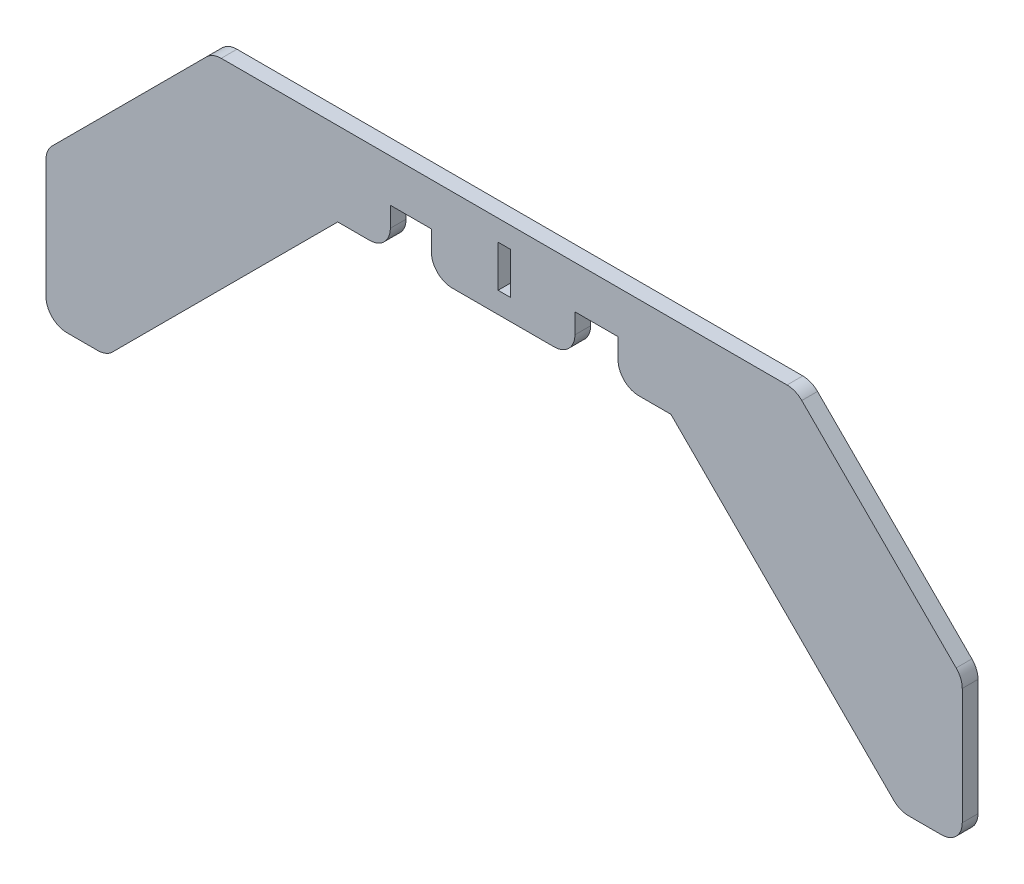
ISO-10303-21;
HEADER;
FILE_DESCRIPTION(('STEP AP214'),'2;1');
FILE_NAME('part.step','',(''),(''),'','','');
FILE_SCHEMA(('AUTOMOTIVE_DESIGN { 1 0 10303 214 1 1 1 1 }'));
ENDSEC;
DATA;
#1=APPLICATION_CONTEXT('core data for automotive mechanical design processes');
#2=APPLICATION_PROTOCOL_DEFINITION('international standard','automotive_design',2000,#1);
#3=PRODUCT_CONTEXT('',#1,'mechanical');
#4=PRODUCT('Part','Part','',(#3));
#5=PRODUCT_RELATED_PRODUCT_CATEGORY('part','',(#4));
#6=PRODUCT_DEFINITION_FORMATION('','',#4);
#7=PRODUCT_DEFINITION_CONTEXT('part definition',#1,'design');
#8=PRODUCT_DEFINITION('design','',#6,#7);
#9=PRODUCT_DEFINITION_SHAPE('','',#8);
#10=(LENGTH_UNIT() NAMED_UNIT(*) SI_UNIT(.MILLI.,.METRE.));
#11=(NAMED_UNIT(*) PLANE_ANGLE_UNIT() SI_UNIT($,.RADIAN.));
#12=(NAMED_UNIT(*) SI_UNIT($,.STERADIAN.) SOLID_ANGLE_UNIT());
#13=UNCERTAINTY_MEASURE_WITH_UNIT(LENGTH_MEASURE(1.E-05),#10,'distance_accuracy_value','');
#14=(GEOMETRIC_REPRESENTATION_CONTEXT(3) GLOBAL_UNCERTAINTY_ASSIGNED_CONTEXT((#13)) GLOBAL_UNIT_ASSIGNED_CONTEXT((#10,
#11,#12)) REPRESENTATION_CONTEXT('',''));
#15=CARTESIAN_POINT('',(0.,0.,0.));
#16=DIRECTION('',(0.,0.,1.));
#17=DIRECTION('',(1.,0.,0.));
#18=AXIS2_PLACEMENT_3D('',#15,#16,#17);
#19=CARTESIAN_POINT('',(0.,0.,4.800000052));
#20=DIRECTION('',(1.,0.,0.));
#21=DIRECTION('',(0.,0.,-1.));
#22=AXIS2_PLACEMENT_3D('',#19,#20,#21);
#23=PLANE('',#22);
#24=DIRECTION('',(0.,-1.,0.));
#25=VECTOR('',#24,1.);
#26=CARTESIAN_POINT('',(0.,0.,0.));
#27=LINE('',#26,#25);
#28=CARTESIAN_POINT('',(0.,115.297426438687,0.));
#29=VERTEX_POINT('',#28);
#30=CARTESIAN_POINT('',(0.,79.0740773047004,0.));
#31=VERTEX_POINT('',#30);
#32=EDGE_CURVE('E552',#29,#31,#27,.T.);
#33=ORIENTED_EDGE('',*,*,#32,.T.);
#34=DIRECTION('',(0.,0.,-1.));
#35=VECTOR('',#34,1.);
#36=CARTESIAN_POINT('',(0.,79.0740773047004,4.800000052));
#37=LINE('',#36,#35);
#38=CARTESIAN_POINT('',(0.,79.0740773047004,4.800000052));
#39=VERTEX_POINT('',#38);
#40=EDGE_CURVE('E205',#31,#39,#37,.F.);
#41=ORIENTED_EDGE('',*,*,#40,.T.);
#42=DIRECTION('',(0.,-1.,0.));
#43=VECTOR('',#42,1.);
#44=CARTESIAN_POINT('',(0.,0.,4.800000052));
#45=LINE('',#44,#43);
#46=CARTESIAN_POINT('',(0.,115.297426438687,4.800000052));
#47=VERTEX_POINT('',#46);
#48=EDGE_CURVE('E560',#47,#39,#45,.T.);
#49=ORIENTED_EDGE('',*,*,#48,.F.);
#50=DIRECTION('',(0.,0.,-1.));
#51=VECTOR('',#50,1.);
#52=CARTESIAN_POINT('',(0.,115.297426438687,4.800000052));
#53=LINE('',#52,#51);
#54=EDGE_CURVE('E622',#47,#29,#53,.T.);
#55=ORIENTED_EDGE('',*,*,#54,.T.);
#56=EDGE_LOOP('',(#33,#41,#49,#55));
#57=FACE_BOUND('',#56,.T.);
#58=ADVANCED_FACE('F190',(#57),#23,.F.);
#59=CARTESIAN_POINT('',(279.4,0.,4.800000052));
#60=DIRECTION('',(-1.,0.,0.));
#61=DIRECTION('',(0.,0.,1.));
#62=AXIS2_PLACEMENT_3D('',#59,#60,#61);
#63=PLANE('',#62);
#64=DIRECTION('',(0.,1.,0.));
#65=VECTOR('',#64,1.);
#66=CARTESIAN_POINT('',(279.4,0.,0.));
#67=LINE('',#66,#65);
#68=CARTESIAN_POINT('',(279.4,79.8276825597565,0.));
#69=VERTEX_POINT('',#68);
#70=CARTESIAN_POINT('',(279.4,115.297426438687,0.));
#71=VERTEX_POINT('',#70);
#72=EDGE_CURVE('E563',#69,#71,#67,.T.);
#73=ORIENTED_EDGE('',*,*,#72,.T.);
#74=DIRECTION('',(0.,0.,-1.));
#75=VECTOR('',#74,1.);
#76=CARTESIAN_POINT('',(279.4,115.297426438687,4.800000052));
#77=LINE('',#76,#75);
#78=CARTESIAN_POINT('',(279.4,115.297426438687,4.800000052));
#79=VERTEX_POINT('',#78);
#80=EDGE_CURVE('E644',#71,#79,#77,.F.);
#81=ORIENTED_EDGE('',*,*,#80,.T.);
#82=DIRECTION('',(0.,1.,0.));
#83=VECTOR('',#82,1.);
#84=CARTESIAN_POINT('',(279.4,0.,4.800000052));
#85=LINE('',#84,#83);
#86=CARTESIAN_POINT('',(279.4,79.8276825597565,4.800000052));
#87=VERTEX_POINT('',#86);
#88=EDGE_CURVE('E562',#87,#79,#85,.T.);
#89=ORIENTED_EDGE('',*,*,#88,.F.);
#90=DIRECTION('',(0.,0.,-1.));
#91=VECTOR('',#90,1.);
#92=CARTESIAN_POINT('',(279.4,79.8276825597565,0.));
#93=LINE('',#92,#91);
#94=EDGE_CURVE('E641',#87,#69,#93,.T.);
#95=ORIENTED_EDGE('',*,*,#94,.T.);
#96=EDGE_LOOP('',(#73,#81,#89,#95));
#97=FACE_BOUND('',#96,.T.);
#98=ADVANCED_FACE('F685',(#97),#63,.F.);
#99=CARTESIAN_POINT('',(0.,0.,4.800000052));
#100=DIRECTION('',(0.,0.,-1.));
#101=DIRECTION('',(-1.,0.,0.));
#102=AXIS2_PLACEMENT_3D('',#99,#100,#101);
#103=PLANE('',#102);
#104=DIRECTION('',(-1.,0.,0.));
#105=VECTOR('',#104,1.);
#106=CARTESIAN_POINT('',(0.,72.7240773047004,4.800000052));
#107=LINE('',#106,#105);
#108=CARTESIAN_POINT('',(15.7809735631963,72.7240773047004,4.800000052));
#109=VERTEX_POINT('',#108);
#110=CARTESIAN_POINT('',(6.35,72.7240773047004,4.800000052));
#111=VERTEX_POINT('',#110);
#112=EDGE_CURVE('E424',#109,#111,#107,.T.);
#113=ORIENTED_EDGE('',*,*,#112,.F.);
#114=CARTESIAN_POINT('',(15.7809735631963,79.0740773047004,4.800000052));
#115=DIRECTION('',(0.,0.,-1.));
#116=DIRECTION('',(-1.,0.,0.));
#117=AXIS2_PLACEMENT_3D('',#114,#115,#116);
#118=CIRCLE('',#117,6.35);
#119=CARTESIAN_POINT('',(20.2711016237309,74.5839492441658,4.800000052));
#120=VERTEX_POINT('',#119);
#121=EDGE_CURVE('E420',#109,#120,#118,.F.);
#122=ORIENTED_EDGE('',*,*,#121,.T.);
#123=DIRECTION('',(0.707106781186548,0.707106781186548,0.));
#124=VECTOR('',#123,1.);
#125=CARTESIAN_POINT('',(-27.1564238102175,27.1564238102175,4.800000052));
#126=LINE('',#125,#124);
#127=CARTESIAN_POINT('',(88.9574174696608,143.270265090096,4.800000052));
#128=VERTEX_POINT('',#127);
#129=EDGE_CURVE('E411',#120,#128,#126,.T.);
#130=ORIENTED_EDGE('',*,*,#129,.T.);
#131=DIRECTION('',(1.,0.,0.));
#132=VECTOR('',#131,1.);
#133=CARTESIAN_POINT('',(0.,143.270265090096,4.800000052));
#134=LINE('',#133,#132);
#135=CARTESIAN_POINT('',(98.6510949411396,143.270265090096,4.800000052));
#136=VERTEX_POINT('',#135);
#137=EDGE_CURVE('E417',#128,#136,#134,.T.);
#138=ORIENTED_EDGE('',*,*,#137,.T.);
#139=CARTESIAN_POINT('',(98.6510949411396,149.620265090096,4.800000052));
#140=DIRECTION('',(0.,0.,-1.));
#141=DIRECTION('',(-1.,0.,0.));
#142=AXIS2_PLACEMENT_3D('',#139,#140,#141);
#143=CIRCLE('',#142,6.35);
#144=CARTESIAN_POINT('',(105.00109494114,149.620265090096,4.800000052));
#145=VERTEX_POINT('',#144);
#146=EDGE_CURVE('E610',#136,#145,#143,.F.);
#147=ORIENTED_EDGE('',*,*,#146,.T.);
#148=DIRECTION('',(0.,1.,0.));
#149=VECTOR('',#148,1.);
#150=CARTESIAN_POINT('',(105.00109494114,0.,4.800000052));
#151=LINE('',#150,#149);
#152=CARTESIAN_POINT('',(105.00109494114,155.712820870524,4.800000052));
#153=VERTEX_POINT('',#152);
#154=EDGE_CURVE('E440',#145,#153,#151,.T.);
#155=ORIENTED_EDGE('',*,*,#154,.T.);
#156=DIRECTION('',(1.,0.,0.));
#157=VECTOR('',#156,1.);
#158=CARTESIAN_POINT('',(0.,155.712820870524,4.800000052));
#159=LINE('',#158,#157);
#160=CARTESIAN_POINT('',(117.513728436182,155.712820870524,4.800000052));
#161=VERTEX_POINT('',#160);
#162=EDGE_CURVE('E444',#153,#161,#159,.T.);
#163=ORIENTED_EDGE('',*,*,#162,.T.);
#164=DIRECTION('',(0.,1.,0.));
#165=VECTOR('',#164,1.);
#166=CARTESIAN_POINT('',(117.513728436182,-1.31068778514753E-13,4.800000052));
#167=LINE('',#166,#165);
#168=CARTESIAN_POINT('',(117.513728436182,149.620265090096,4.800000052));
#169=VERTEX_POINT('',#168);
#170=EDGE_CURVE('E450',#169,#161,#167,.T.);
#171=ORIENTED_EDGE('',*,*,#170,.F.);
#172=CARTESIAN_POINT('',(123.863728436182,149.620265090096,4.800000052));
#173=DIRECTION('',(0.,0.,-1.));
#174=DIRECTION('',(-1.,0.,0.));
#175=AXIS2_PLACEMENT_3D('',#172,#173,#174);
#176=CIRCLE('',#175,6.35);
#177=CARTESIAN_POINT('',(123.863728436182,143.270265090096,4.800000052));
#178=VERTEX_POINT('',#177);
#179=EDGE_CURVE('E608',#169,#178,#176,.F.);
#180=ORIENTED_EDGE('',*,*,#179,.T.);
#181=CARTESIAN_POINT('',(154.93323771039,143.270265090096,4.800000052));
#182=VERTEX_POINT('',#181);
#183=EDGE_CURVE('E443',#178,#182,#134,.T.);
#184=ORIENTED_EDGE('',*,*,#183,.T.);
#185=CARTESIAN_POINT('',(154.93323771039,149.620265090096,4.800000052));
#186=DIRECTION('',(0.,0.,-1.));
#187=DIRECTION('',(-1.,0.,0.));
#188=AXIS2_PLACEMENT_3D('',#185,#186,#187);
#189=CIRCLE('',#188,6.35);
#190=CARTESIAN_POINT('',(161.28323771039,149.620265090096,4.800000052));
#191=VERTEX_POINT('',#190);
#192=EDGE_CURVE('E606',#182,#191,#189,.F.);
#193=ORIENTED_EDGE('',*,*,#192,.T.);
#194=DIRECTION('',(0.,1.,0.));
#195=VECTOR('',#194,1.);
#196=CARTESIAN_POINT('',(161.28323771039,0.,4.800000052));
#197=LINE('',#196,#195);
#198=CARTESIAN_POINT('',(161.28323771039,155.712820870524,4.800000052));
#199=VERTEX_POINT('',#198);
#200=EDGE_CURVE('E449',#191,#199,#197,.T.);
#201=ORIENTED_EDGE('',*,*,#200,.T.);
#202=DIRECTION('',(1.,0.,0.));
#203=VECTOR('',#202,1.);
#204=CARTESIAN_POINT('',(0.,155.712820870524,4.800000052));
#205=LINE('',#204,#203);
#206=CARTESIAN_POINT('',(174.431585666931,155.712820870524,4.800000052));
#207=VERTEX_POINT('',#206);
#208=EDGE_CURVE('E453',#199,#207,#205,.T.);
#209=ORIENTED_EDGE('',*,*,#208,.T.);
#210=DIRECTION('',(0.,1.,0.));
#211=VECTOR('',#210,1.);
#212=CARTESIAN_POINT('',(174.431585666932,3.89104067618317E-13,4.800000052));
#213=LINE('',#212,#211);
#214=CARTESIAN_POINT('',(174.431585666931,149.620265090096,4.800000052));
#215=VERTEX_POINT('',#214);
#216=EDGE_CURVE('E447',#215,#207,#213,.T.);
#217=ORIENTED_EDGE('',*,*,#216,.F.);
#218=CARTESIAN_POINT('',(180.781585666931,149.620265090096,4.800000052));
#219=DIRECTION('',(0.,0.,-1.));
#220=DIRECTION('',(-1.,0.,0.));
#221=AXIS2_PLACEMENT_3D('',#218,#219,#220);
#222=CIRCLE('',#221,6.35);
#223=CARTESIAN_POINT('',(180.781585666931,143.270265090096,4.800000052));
#224=VERTEX_POINT('',#223);
#225=EDGE_CURVE('E604',#215,#224,#222,.F.);
#226=ORIENTED_EDGE('',*,*,#225,.T.);
#227=CARTESIAN_POINT('',(190.557417469661,143.270265090096,4.800000052));
#228=VERTEX_POINT('',#227);
#229=EDGE_CURVE('E442',#224,#228,#134,.T.);
#230=ORIENTED_EDGE('',*,*,#229,.T.);
#231=DIRECTION('',(0.707106781186548,-0.707106781186548,0.));
#232=VECTOR('',#231,1.);
#233=CARTESIAN_POINT('',(166.913841279878,166.913841279878,4.800000052));
#234=LINE('',#233,#232);
#235=CARTESIAN_POINT('',(258.490128060535,75.3375544992219,4.800000052));
#236=VERTEX_POINT('',#235);
#237=EDGE_CURVE('E446',#228,#236,#234,.T.);
#238=ORIENTED_EDGE('',*,*,#237,.T.);
#239=CARTESIAN_POINT('',(262.980256121069,79.8276825597565,4.800000052));
#240=DIRECTION('',(0.,0.,-1.));
#241=DIRECTION('',(-1.,0.,0.));
#242=AXIS2_PLACEMENT_3D('',#239,#240,#241);
#243=CIRCLE('',#242,6.35);
#244=CARTESIAN_POINT('',(262.980256121069,73.4776825597565,4.800000052));
#245=VERTEX_POINT('',#244);
#246=EDGE_CURVE('E602',#236,#245,#243,.F.);
#247=ORIENTED_EDGE('',*,*,#246,.T.);
#248=DIRECTION('',(-1.,0.,0.));
#249=VECTOR('',#248,1.);
#250=CARTESIAN_POINT('',(0.,73.4776825597565,4.800000052));
#251=LINE('',#250,#249);
#252=CARTESIAN_POINT('',(273.05,73.4776825597565,4.800000052));
#253=VERTEX_POINT('',#252);
#254=EDGE_CURVE('E435',#253,#245,#251,.T.);
#255=ORIENTED_EDGE('',*,*,#254,.F.);
#256=CARTESIAN_POINT('',(273.05,79.8276825597565,4.800000052));
#257=DIRECTION('',(0.,0.,-1.));
#258=DIRECTION('',(-1.,0.,0.));
#259=AXIS2_PLACEMENT_3D('',#256,#257,#258);
#260=CIRCLE('',#259,6.35);
#261=EDGE_CURVE('E600',#253,#87,#260,.F.);
#262=ORIENTED_EDGE('',*,*,#261,.T.);
#263=ORIENTED_EDGE('',*,*,#88,.T.);
#264=CARTESIAN_POINT('',(273.05,115.297426438687,4.800000052));
#265=DIRECTION('',(0.,0.,-1.));
#266=DIRECTION('',(-1.,0.,0.));
#267=AXIS2_PLACEMENT_3D('',#264,#265,#266);
#268=CIRCLE('',#267,6.35);
#269=CARTESIAN_POINT('',(277.540128060535,119.787554499221,4.800000052));
#270=VERTEX_POINT('',#269);
#271=EDGE_CURVE('E614',#79,#270,#268,.F.);
#272=ORIENTED_EDGE('',*,*,#271,.T.);
#273=DIRECTION('',(0.707106781186542,-0.707106781186554,0.));
#274=VECTOR('',#273,1.);
#275=CARTESIAN_POINT('',(198.66384127988,198.663841279877,4.800000052));
#276=LINE('',#275,#274);
#277=CARTESIAN_POINT('',(230.459871939466,166.867810620291,4.800000052));
#278=VERTEX_POINT('',#277);
#279=EDGE_CURVE('E543',#278,#270,#276,.T.);
#280=ORIENTED_EDGE('',*,*,#279,.F.);
#281=CARTESIAN_POINT('',(225.969743878931,162.377682559757,4.800000052));
#282=DIRECTION('',(0.,0.,-1.));
#283=DIRECTION('',(-1.,0.,0.));
#284=AXIS2_PLACEMENT_3D('',#281,#282,#283);
#285=CIRCLE('',#284,6.35);
#286=CARTESIAN_POINT('',(225.969743878931,168.727682559757,4.800000052));
#287=VERTEX_POINT('',#286);
#288=EDGE_CURVE('E612',#278,#287,#285,.F.);
#289=ORIENTED_EDGE('',*,*,#288,.T.);
#290=DIRECTION('',(1.,0.,0.));
#291=VECTOR('',#290,1.);
#292=CARTESIAN_POINT('',(0.,168.727682559757,4.800000052));
#293=LINE('',#292,#291);
#294=CARTESIAN_POINT('',(53.4302561210691,168.727682559757,4.800000052));
#295=VERTEX_POINT('',#294);
#296=EDGE_CURVE('E546',#295,#287,#293,.T.);
#297=ORIENTED_EDGE('',*,*,#296,.F.);
#298=CARTESIAN_POINT('',(53.4302561210691,162.377682559757,4.800000052));
#299=DIRECTION('',(0.,0.,-1.));
#300=DIRECTION('',(-1.,0.,0.));
#301=AXIS2_PLACEMENT_3D('',#298,#299,#300);
#302=CIRCLE('',#301,6.35);
#303=CARTESIAN_POINT('',(48.9401280605345,166.867810620291,4.800000052));
#304=VERTEX_POINT('',#303);
#305=EDGE_CURVE('E616',#295,#304,#302,.F.);
#306=ORIENTED_EDGE('',*,*,#305,.T.);
#307=DIRECTION('',(-0.707106781186547,-0.707106781186548,0.));
#308=VECTOR('',#307,1.);
#309=CARTESIAN_POINT('',(-58.9638412798783,58.9638412798782,4.800000052));
#310=LINE('',#309,#308);
#311=CARTESIAN_POINT('',(1.85987193946542,119.787554499222,4.800000052));
#312=VERTEX_POINT('',#311);
#313=EDGE_CURVE('E550',#304,#312,#310,.T.);
#314=ORIENTED_EDGE('',*,*,#313,.T.);
#315=CARTESIAN_POINT('',(6.35,115.297426438687,4.800000052));
#316=DIRECTION('',(0.,0.,-1.));
#317=DIRECTION('',(-1.,0.,0.));
#318=AXIS2_PLACEMENT_3D('',#315,#316,#317);
#319=CIRCLE('',#318,6.35);
#320=EDGE_CURVE('E212',#312,#47,#319,.F.);
#321=ORIENTED_EDGE('',*,*,#320,.T.);
#322=ORIENTED_EDGE('',*,*,#48,.T.);
#323=CARTESIAN_POINT('',(6.35,79.0740773047004,4.800000052));
#324=DIRECTION('',(0.,0.,-1.));
#325=DIRECTION('',(-1.,0.,0.));
#326=AXIS2_PLACEMENT_3D('',#323,#324,#325);
#327=CIRCLE('',#326,6.35);
#328=EDGE_CURVE('E619',#39,#111,#327,.F.);
#329=ORIENTED_EDGE('',*,*,#328,.T.);
#330=EDGE_LOOP('',(#113,#122,#130,#138,#147,#155,#163,#171,#180,#184,#193,#201,#209,#217,#226,
#230,#238,#247,#255,#262,#263,#272,#280,#289,#297,#306,#314,#321,#322,#329));
#331=FACE_BOUND('',#330,.T.);
#332=DIRECTION('',(0.,-1.,0.));
#333=VECTOR('',#332,1.);
#334=CARTESIAN_POINT('',(137.852417469661,3.01273480069009E-13,4.800000052));
#335=LINE('',#334,#333);
#336=CARTESIAN_POINT('',(137.852417469661,162.377682559757,4.800000052));
#337=VERTEX_POINT('',#336);
#338=CARTESIAN_POINT('',(137.852417469661,149.677682559757,4.800000052));
#339=VERTEX_POINT('',#338);
#340=EDGE_CURVE('E512',#337,#339,#335,.T.);
#341=ORIENTED_EDGE('',*,*,#340,.F.);
#342=DIRECTION('',(-1.,0.,0.));
#343=VECTOR('',#342,1.);
#344=CARTESIAN_POINT('',(0.,162.377682559757,4.800000052));
#345=LINE('',#344,#343);
#346=CARTESIAN_POINT('',(141.662417469661,162.377682559757,4.800000052));
#347=VERTEX_POINT('',#346);
#348=EDGE_CURVE('E514',#347,#337,#345,.T.);
#349=ORIENTED_EDGE('',*,*,#348,.F.);
#350=DIRECTION('',(0.,-1.,0.));
#351=VECTOR('',#350,1.);
#352=CARTESIAN_POINT('',(141.662417469661,0.,4.800000052));
#353=LINE('',#352,#351);
#354=CARTESIAN_POINT('',(141.662417469661,149.677682559757,4.800000052));
#355=VERTEX_POINT('',#354);
#356=EDGE_CURVE('E517',#347,#355,#353,.T.);
#357=ORIENTED_EDGE('',*,*,#356,.T.);
#358=DIRECTION('',(-1.,0.,0.));
#359=VECTOR('',#358,1.);
#360=CARTESIAN_POINT('',(0.,149.677682559757,4.800000052));
#361=LINE('',#360,#359);
#362=EDGE_CURVE('E520',#355,#339,#361,.T.);
#363=ORIENTED_EDGE('',*,*,#362,.T.);
#364=EDGE_LOOP('',(#341,#349,#357,#363));
#365=FACE_BOUND('',#364,.T.);
#366=ADVANCED_FACE('F414',(#331,#365),#103,.F.);
#367=CARTESIAN_POINT('',(0.,0.,0.));
#368=DIRECTION('',(0.,0.,-1.));
#369=DIRECTION('',(-1.,0.,0.));
#370=AXIS2_PLACEMENT_3D('',#367,#368,#369);
#371=PLANE('',#370);
#372=DIRECTION('',(0.707106781186548,0.707106781186548,0.));
#373=VECTOR('',#372,1.);
#374=CARTESIAN_POINT('',(-27.1564238102175,27.1564238102175,0.));
#375=LINE('',#374,#373);
#376=CARTESIAN_POINT('',(20.2711016237309,74.5839492441658,0.));
#377=VERTEX_POINT('',#376);
#378=CARTESIAN_POINT('',(88.9574174696608,143.270265090096,0.));
#379=VERTEX_POINT('',#378);
#380=EDGE_CURVE('E430',#377,#379,#375,.T.);
#381=ORIENTED_EDGE('',*,*,#380,.F.);
#382=CARTESIAN_POINT('',(15.7809735631963,79.0740773047004,0.));
#383=DIRECTION('',(0.,0.,-1.));
#384=DIRECTION('',(-1.,0.,0.));
#385=AXIS2_PLACEMENT_3D('',#382,#383,#384);
#386=CIRCLE('',#385,6.35);
#387=CARTESIAN_POINT('',(15.7809735631963,72.7240773047004,0.));
#388=VERTEX_POINT('',#387);
#389=EDGE_CURVE('E593',#377,#388,#386,.T.);
#390=ORIENTED_EDGE('',*,*,#389,.T.);
#391=DIRECTION('',(-1.,0.,0.));
#392=VECTOR('',#391,1.);
#393=CARTESIAN_POINT('',(0.,72.7240773047004,0.));
#394=LINE('',#393,#392);
#395=CARTESIAN_POINT('',(6.35,72.7240773047004,0.));
#396=VERTEX_POINT('',#395);
#397=EDGE_CURVE('E470',#388,#396,#394,.T.);
#398=ORIENTED_EDGE('',*,*,#397,.T.);
#399=CARTESIAN_POINT('',(6.35,79.0740773047004,0.));
#400=DIRECTION('',(0.,0.,-1.));
#401=DIRECTION('',(-1.,0.,0.));
#402=AXIS2_PLACEMENT_3D('',#399,#400,#401);
#403=CIRCLE('',#402,6.35);
#404=EDGE_CURVE('E591',#396,#31,#403,.T.);
#405=ORIENTED_EDGE('',*,*,#404,.T.);
#406=ORIENTED_EDGE('',*,*,#32,.F.);
#407=CARTESIAN_POINT('',(6.35,115.297426438687,0.));
#408=DIRECTION('',(0.,0.,-1.));
#409=DIRECTION('',(-1.,0.,0.));
#410=AXIS2_PLACEMENT_3D('',#407,#408,#409);
#411=CIRCLE('',#410,6.35);
#412=CARTESIAN_POINT('',(1.85987193946542,119.787554499222,0.));
#413=VERTEX_POINT('',#412);
#414=EDGE_CURVE('E589',#29,#413,#411,.T.);
#415=ORIENTED_EDGE('',*,*,#414,.T.);
#416=DIRECTION('',(-0.707106781186547,-0.707106781186548,0.));
#417=VECTOR('',#416,1.);
#418=CARTESIAN_POINT('',(-58.9638412798783,58.9638412798782,0.));
#419=LINE('',#418,#417);
#420=CARTESIAN_POINT('',(48.9401280605345,166.867810620291,0.));
#421=VERTEX_POINT('',#420);
#422=EDGE_CURVE('E547',#421,#413,#419,.T.);
#423=ORIENTED_EDGE('',*,*,#422,.F.);
#424=CARTESIAN_POINT('',(53.4302561210691,162.377682559757,0.));
#425=DIRECTION('',(0.,0.,-1.));
#426=DIRECTION('',(-1.,0.,0.));
#427=AXIS2_PLACEMENT_3D('',#424,#425,#426);
#428=CIRCLE('',#427,6.35);
#429=CARTESIAN_POINT('',(53.4302561210691,168.727682559757,0.));
#430=VERTEX_POINT('',#429);
#431=EDGE_CURVE('E587',#421,#430,#428,.T.);
#432=ORIENTED_EDGE('',*,*,#431,.T.);
#433=DIRECTION('',(1.,0.,0.));
#434=VECTOR('',#433,1.);
#435=CARTESIAN_POINT('',(0.,168.727682559757,0.));
#436=LINE('',#435,#434);
#437=CARTESIAN_POINT('',(225.969743878931,168.727682559757,0.));
#438=VERTEX_POINT('',#437);
#439=EDGE_CURVE('E555',#430,#438,#436,.T.);
#440=ORIENTED_EDGE('',*,*,#439,.T.);
#441=CARTESIAN_POINT('',(225.969743878931,162.377682559757,0.));
#442=DIRECTION('',(0.,0.,-1.));
#443=DIRECTION('',(-1.,0.,0.));
#444=AXIS2_PLACEMENT_3D('',#441,#442,#443);
#445=CIRCLE('',#444,6.35);
#446=CARTESIAN_POINT('',(230.459871939466,166.867810620291,0.));
#447=VERTEX_POINT('',#446);
#448=EDGE_CURVE('E583',#438,#447,#445,.T.);
#449=ORIENTED_EDGE('',*,*,#448,.T.);
#450=DIRECTION('',(0.707106781186542,-0.707106781186554,0.));
#451=VECTOR('',#450,1.);
#452=CARTESIAN_POINT('',(198.66384127988,198.663841279877,0.));
#453=LINE('',#452,#451);
#454=CARTESIAN_POINT('',(277.540128060535,119.787554499221,0.));
#455=VERTEX_POINT('',#454);
#456=EDGE_CURVE('E536',#447,#455,#453,.T.);
#457=ORIENTED_EDGE('',*,*,#456,.T.);
#458=CARTESIAN_POINT('',(273.05,115.297426438687,0.));
#459=DIRECTION('',(0.,0.,-1.));
#460=DIRECTION('',(-1.,0.,0.));
#461=AXIS2_PLACEMENT_3D('',#458,#459,#460);
#462=CIRCLE('',#461,6.35);
#463=EDGE_CURVE('E585',#455,#71,#462,.T.);
#464=ORIENTED_EDGE('',*,*,#463,.T.);
#465=ORIENTED_EDGE('',*,*,#72,.F.);
#466=CARTESIAN_POINT('',(273.05,79.8276825597565,0.));
#467=DIRECTION('',(0.,0.,-1.));
#468=DIRECTION('',(-1.,0.,0.));
#469=AXIS2_PLACEMENT_3D('',#466,#467,#468);
#470=CIRCLE('',#469,6.35);
#471=CARTESIAN_POINT('',(273.05,73.4776825597565,0.));
#472=VERTEX_POINT('',#471);
#473=EDGE_CURVE('E571',#69,#472,#470,.T.);
#474=ORIENTED_EDGE('',*,*,#473,.T.);
#475=DIRECTION('',(-1.,0.,0.));
#476=VECTOR('',#475,1.);
#477=CARTESIAN_POINT('',(0.,73.4776825597565,0.));
#478=LINE('',#477,#476);
#479=CARTESIAN_POINT('',(262.980256121069,73.4776825597565,0.));
#480=VERTEX_POINT('',#479);
#481=EDGE_CURVE('E495',#472,#480,#478,.T.);
#482=ORIENTED_EDGE('',*,*,#481,.T.);
#483=CARTESIAN_POINT('',(262.980256121069,79.8276825597565,0.));
#484=DIRECTION('',(0.,0.,-1.));
#485=DIRECTION('',(-1.,0.,0.));
#486=AXIS2_PLACEMENT_3D('',#483,#484,#485);
#487=CIRCLE('',#486,6.35);
#488=CARTESIAN_POINT('',(258.490128060535,75.3375544992219,0.));
#489=VERTEX_POINT('',#488);
#490=EDGE_CURVE('E573',#480,#489,#487,.T.);
#491=ORIENTED_EDGE('',*,*,#490,.T.);
#492=DIRECTION('',(0.707106781186548,-0.707106781186548,0.));
#493=VECTOR('',#492,1.);
#494=CARTESIAN_POINT('',(166.913841279878,166.913841279878,0.));
#495=LINE('',#494,#493);
#496=CARTESIAN_POINT('',(190.557417469661,143.270265090096,0.));
#497=VERTEX_POINT('',#496);
#498=EDGE_CURVE('E492',#497,#489,#495,.T.);
#499=ORIENTED_EDGE('',*,*,#498,.F.);
#500=DIRECTION('',(1.,0.,0.));
#501=VECTOR('',#500,1.);
#502=CARTESIAN_POINT('',(0.,143.270265090096,0.));
#503=LINE('',#502,#501);
#504=CARTESIAN_POINT('',(180.781585666931,143.270265090096,0.));
#505=VERTEX_POINT('',#504);
#506=EDGE_CURVE('E478',#505,#497,#503,.T.);
#507=ORIENTED_EDGE('',*,*,#506,.F.);
#508=CARTESIAN_POINT('',(180.781585666931,149.620265090096,0.));
#509=DIRECTION('',(0.,0.,-1.));
#510=DIRECTION('',(-1.,0.,0.));
#511=AXIS2_PLACEMENT_3D('',#508,#509,#510);
#512=CIRCLE('',#511,6.35);
#513=CARTESIAN_POINT('',(174.431585666931,149.620265090096,0.));
#514=VERTEX_POINT('',#513);
#515=EDGE_CURVE('E575',#505,#514,#512,.T.);
#516=ORIENTED_EDGE('',*,*,#515,.T.);
#517=DIRECTION('',(0.,1.,0.));
#518=VECTOR('',#517,1.);
#519=CARTESIAN_POINT('',(174.431585666932,3.89104067618317E-13,0.));
#520=LINE('',#519,#518);
#521=CARTESIAN_POINT('',(174.431585666931,155.712820870524,0.));
#522=VERTEX_POINT('',#521);
#523=EDGE_CURVE('E490',#514,#522,#520,.T.);
#524=ORIENTED_EDGE('',*,*,#523,.T.);
#525=DIRECTION('',(1.,0.,0.));
#526=VECTOR('',#525,1.);
#527=CARTESIAN_POINT('',(0.,155.712820870524,0.));
#528=LINE('',#527,#526);
#529=CARTESIAN_POINT('',(161.28323771039,155.712820870524,0.));
#530=VERTEX_POINT('',#529);
#531=EDGE_CURVE('E487',#530,#522,#528,.T.);
#532=ORIENTED_EDGE('',*,*,#531,.F.);
#533=DIRECTION('',(0.,1.,0.));
#534=VECTOR('',#533,1.);
#535=CARTESIAN_POINT('',(161.28323771039,0.,0.));
#536=LINE('',#535,#534);
#537=CARTESIAN_POINT('',(161.28323771039,149.620265090096,0.));
#538=VERTEX_POINT('',#537);
#539=EDGE_CURVE('E485',#538,#530,#536,.T.);
#540=ORIENTED_EDGE('',*,*,#539,.F.);
#541=CARTESIAN_POINT('',(154.93323771039,149.620265090096,0.));
#542=DIRECTION('',(0.,0.,-1.));
#543=DIRECTION('',(-1.,0.,0.));
#544=AXIS2_PLACEMENT_3D('',#541,#542,#543);
#545=CIRCLE('',#544,6.35);
#546=CARTESIAN_POINT('',(154.93323771039,143.270265090096,0.));
#547=VERTEX_POINT('',#546);
#548=EDGE_CURVE('E577',#538,#547,#545,.T.);
#549=ORIENTED_EDGE('',*,*,#548,.T.);
#550=CARTESIAN_POINT('',(123.863728436182,143.270265090096,0.));
#551=VERTEX_POINT('',#550);
#552=EDGE_CURVE('E477',#551,#547,#503,.T.);
#553=ORIENTED_EDGE('',*,*,#552,.F.);
#554=CARTESIAN_POINT('',(123.863728436182,149.620265090096,0.));
#555=DIRECTION('',(0.,0.,-1.));
#556=DIRECTION('',(-1.,0.,0.));
#557=AXIS2_PLACEMENT_3D('',#554,#555,#556);
#558=CIRCLE('',#557,6.35);
#559=CARTESIAN_POINT('',(117.513728436182,149.620265090096,0.));
#560=VERTEX_POINT('',#559);
#561=EDGE_CURVE('E579',#551,#560,#558,.T.);
#562=ORIENTED_EDGE('',*,*,#561,.T.);
#563=DIRECTION('',(0.,1.,0.));
#564=VECTOR('',#563,1.);
#565=CARTESIAN_POINT('',(117.513728436182,-1.31068778514753E-13,0.));
#566=LINE('',#565,#564);
#567=CARTESIAN_POINT('',(117.513728436182,155.712820870524,0.));
#568=VERTEX_POINT('',#567);
#569=EDGE_CURVE('E483',#560,#568,#566,.T.);
#570=ORIENTED_EDGE('',*,*,#569,.T.);
#571=DIRECTION('',(1.,0.,0.));
#572=VECTOR('',#571,1.);
#573=CARTESIAN_POINT('',(0.,155.712820870524,0.));
#574=LINE('',#573,#572);
#575=CARTESIAN_POINT('',(105.00109494114,155.712820870524,0.));
#576=VERTEX_POINT('',#575);
#577=EDGE_CURVE('E480',#576,#568,#574,.T.);
#578=ORIENTED_EDGE('',*,*,#577,.F.);
#579=DIRECTION('',(0.,1.,0.));
#580=VECTOR('',#579,1.);
#581=CARTESIAN_POINT('',(105.00109494114,0.,0.));
#582=LINE('',#581,#580);
#583=CARTESIAN_POINT('',(105.00109494114,149.620265090096,0.));
#584=VERTEX_POINT('',#583);
#585=EDGE_CURVE('E476',#584,#576,#582,.T.);
#586=ORIENTED_EDGE('',*,*,#585,.F.);
#587=CARTESIAN_POINT('',(98.6510949411396,149.620265090096,0.));
#588=DIRECTION('',(0.,0.,-1.));
#589=DIRECTION('',(-1.,0.,0.));
#590=AXIS2_PLACEMENT_3D('',#587,#588,#589);
#591=CIRCLE('',#590,6.35);
#592=CARTESIAN_POINT('',(98.6510949411396,143.270265090096,0.));
#593=VERTEX_POINT('',#592);
#594=EDGE_CURVE('E581',#584,#593,#591,.T.);
#595=ORIENTED_EDGE('',*,*,#594,.T.);
#596=EDGE_CURVE('E474',#379,#593,#503,.T.);
#597=ORIENTED_EDGE('',*,*,#596,.F.);
#598=EDGE_LOOP('',(#381,#390,#398,#405,#406,#415,#423,#432,#440,#449,#457,#464,#465,#474,#482,
#491,#499,#507,#516,#524,#532,#540,#549,#553,#562,#570,#578,#586,#595,#597));
#599=FACE_BOUND('',#598,.T.);
#600=DIRECTION('',(-1.,0.,0.));
#601=VECTOR('',#600,1.);
#602=CARTESIAN_POINT('',(0.,162.377682559757,0.));
#603=LINE('',#602,#601);
#604=CARTESIAN_POINT('',(141.662417469661,162.377682559757,0.));
#605=VERTEX_POINT('',#604);
#606=CARTESIAN_POINT('',(137.852417469661,162.377682559757,0.));
#607=VERTEX_POINT('',#606);
#608=EDGE_CURVE('E526',#605,#607,#603,.T.);
#609=ORIENTED_EDGE('',*,*,#608,.T.);
#610=DIRECTION('',(0.,-1.,0.));
#611=VECTOR('',#610,1.);
#612=CARTESIAN_POINT('',(137.852417469661,3.01273480069009E-13,0.));
#613=LINE('',#612,#611);
#614=CARTESIAN_POINT('',(137.852417469661,149.677682559757,0.));
#615=VERTEX_POINT('',#614);
#616=EDGE_CURVE('E501',#607,#615,#613,.T.);
#617=ORIENTED_EDGE('',*,*,#616,.T.);
#618=DIRECTION('',(-1.,0.,0.));
#619=VECTOR('',#618,1.);
#620=CARTESIAN_POINT('',(0.,149.677682559757,0.));
#621=LINE('',#620,#619);
#622=CARTESIAN_POINT('',(141.662417469661,149.677682559757,0.));
#623=VERTEX_POINT('',#622);
#624=EDGE_CURVE('E515',#623,#615,#621,.T.);
#625=ORIENTED_EDGE('',*,*,#624,.F.);
#626=DIRECTION('',(0.,-1.,0.));
#627=VECTOR('',#626,1.);
#628=CARTESIAN_POINT('',(141.662417469661,0.,0.));
#629=LINE('',#628,#627);
#630=EDGE_CURVE('E529',#605,#623,#629,.T.);
#631=ORIENTED_EDGE('',*,*,#630,.F.);
#632=EDGE_LOOP('',(#609,#617,#625,#631));
#633=FACE_BOUND('',#632,.T.);
#634=ADVANCED_FACE('F676',(#599,#633),#371,.T.);
#635=CARTESIAN_POINT('',(198.66384127988,198.663841279877,4.800000052));
#636=DIRECTION('',(0.707106781186554,0.707106781186542,0.));
#637=DIRECTION('',(-0.707106781186542,0.707106781186554,0.));
#638=AXIS2_PLACEMENT_3D('',#635,#636,#637);
#639=PLANE('',#638);
#640=ORIENTED_EDGE('',*,*,#279,.T.);
#641=DIRECTION('',(0.,0.,-1.));
#642=VECTOR('',#641,1.);
#643=CARTESIAN_POINT('',(277.540128060535,119.787554499221,0.));
#644=LINE('',#643,#642);
#645=EDGE_CURVE('E638',#270,#455,#644,.T.);
#646=ORIENTED_EDGE('',*,*,#645,.T.);
#647=ORIENTED_EDGE('',*,*,#456,.F.);
#648=DIRECTION('',(0.,0.,-1.));
#649=VECTOR('',#648,1.);
#650=CARTESIAN_POINT('',(230.459871939466,166.867810620291,4.800000052));
#651=LINE('',#650,#649);
#652=EDGE_CURVE('E636',#447,#278,#651,.F.);
#653=ORIENTED_EDGE('',*,*,#652,.T.);
#654=EDGE_LOOP('',(#640,#646,#647,#653));
#655=FACE_BOUND('',#654,.T.);
#656=ADVANCED_FACE('F694',(#655),#639,.T.);
#657=CARTESIAN_POINT('',(-58.9638412798783,58.9638412798782,4.800000052));
#658=DIRECTION('',(0.707106781186548,-0.707106781186547,0.));
#659=DIRECTION('',(0.707106781186547,0.707106781186548,0.));
#660=AXIS2_PLACEMENT_3D('',#657,#658,#659);
#661=PLANE('',#660);
#662=ORIENTED_EDGE('',*,*,#422,.T.);
#663=DIRECTION('',(0.,0.,-1.));
#664=VECTOR('',#663,1.);
#665=CARTESIAN_POINT('',(1.85987193946542,119.787554499222,4.800000052));
#666=LINE('',#665,#664);
#667=EDGE_CURVE('E629',#413,#312,#666,.F.);
#668=ORIENTED_EDGE('',*,*,#667,.T.);
#669=ORIENTED_EDGE('',*,*,#313,.F.);
#670=DIRECTION('',(0.,0.,-1.));
#671=VECTOR('',#670,1.);
#672=CARTESIAN_POINT('',(48.9401280605345,166.867810620291,0.));
#673=LINE('',#672,#671);
#674=EDGE_CURVE('E626',#304,#421,#673,.T.);
#675=ORIENTED_EDGE('',*,*,#674,.T.);
#676=EDGE_LOOP('',(#662,#668,#669,#675));
#677=FACE_BOUND('',#676,.T.);
#678=ADVANCED_FACE('F712',(#677),#661,.F.);
#679=CARTESIAN_POINT('',(0.,168.727682559757,4.800000052));
#680=DIRECTION('',(0.,1.,0.));
#681=DIRECTION('',(0.,0.,1.));
#682=AXIS2_PLACEMENT_3D('',#679,#680,#681);
#683=PLANE('',#682);
#684=ORIENTED_EDGE('',*,*,#439,.F.);
#685=DIRECTION('',(0.,0.,-1.));
#686=VECTOR('',#685,1.);
#687=CARTESIAN_POINT('',(53.4302561210691,168.727682559757,4.800000052));
#688=LINE('',#687,#686);
#689=EDGE_CURVE('E634',#430,#295,#688,.F.);
#690=ORIENTED_EDGE('',*,*,#689,.T.);
#691=ORIENTED_EDGE('',*,*,#296,.T.);
#692=DIRECTION('',(0.,0.,-1.));
#693=VECTOR('',#692,1.);
#694=CARTESIAN_POINT('',(225.969743878931,168.727682559757,4.800000052));
#695=LINE('',#694,#693);
#696=EDGE_CURVE('E631',#287,#438,#695,.T.);
#697=ORIENTED_EDGE('',*,*,#696,.T.);
#698=EDGE_LOOP('',(#684,#690,#691,#697));
#699=FACE_BOUND('',#698,.T.);
#700=ADVANCED_FACE('F702',(#699),#683,.T.);
#701=CARTESIAN_POINT('',(0.,72.7240773047004,4.800000052));
#702=DIRECTION('',(0.,-1.,0.));
#703=DIRECTION('',(0.,0.,-1.));
#704=AXIS2_PLACEMENT_3D('',#701,#702,#703);
#705=PLANE('',#704);
#706=ORIENTED_EDGE('',*,*,#397,.F.);
#707=DIRECTION('',(0.,0.,-1.));
#708=VECTOR('',#707,1.);
#709=CARTESIAN_POINT('',(15.7809735631963,72.7240773047004,4.800000052));
#710=LINE('',#709,#708);
#711=EDGE_CURVE('E598',#388,#109,#710,.F.);
#712=ORIENTED_EDGE('',*,*,#711,.T.);
#713=ORIENTED_EDGE('',*,*,#112,.T.);
#714=DIRECTION('',(0.,0.,-1.));
#715=VECTOR('',#714,1.);
#716=CARTESIAN_POINT('',(6.35,72.7240773047004,0.));
#717=LINE('',#716,#715);
#718=EDGE_CURVE('E595',#111,#396,#717,.T.);
#719=ORIENTED_EDGE('',*,*,#718,.T.);
#720=EDGE_LOOP('',(#706,#712,#713,#719));
#721=FACE_BOUND('',#720,.T.);
#722=ADVANCED_FACE('F725',(#721),#705,.T.);
#723=CARTESIAN_POINT('',(0.,73.4776825597565,4.800000052));
#724=DIRECTION('',(0.,-1.,0.));
#725=DIRECTION('',(0.,0.,-1.));
#726=AXIS2_PLACEMENT_3D('',#723,#724,#725);
#727=PLANE('',#726);
#728=ORIENTED_EDGE('',*,*,#254,.T.);
#729=DIRECTION('',(0.,0.,-1.));
#730=VECTOR('',#729,1.);
#731=CARTESIAN_POINT('',(262.980256121069,73.4776825597565,0.));
#732=LINE('',#731,#730);
#733=EDGE_CURVE('E198',#245,#480,#732,.T.);
#734=ORIENTED_EDGE('',*,*,#733,.T.);
#735=ORIENTED_EDGE('',*,*,#481,.F.);
#736=DIRECTION('',(0.,0.,-1.));
#737=VECTOR('',#736,1.);
#738=CARTESIAN_POINT('',(273.05,73.4776825597565,4.800000052));
#739=LINE('',#738,#737);
#740=EDGE_CURVE('E665',#472,#253,#739,.F.);
#741=ORIENTED_EDGE('',*,*,#740,.T.);
#742=EDGE_LOOP('',(#728,#734,#735,#741));
#743=FACE_BOUND('',#742,.T.);
#744=ADVANCED_FACE('F670',(#743),#727,.T.);
#745=CARTESIAN_POINT('',(166.913841279878,166.913841279878,4.800000052));
#746=DIRECTION('',(0.707106781186548,0.707106781186548,0.));
#747=DIRECTION('',(-0.707106781186548,0.707106781186548,0.));
#748=AXIS2_PLACEMENT_3D('',#745,#746,#747);
#749=PLANE('',#748);
#750=ORIENTED_EDGE('',*,*,#498,.T.);
#751=DIRECTION('',(0.,0.,-1.));
#752=VECTOR('',#751,1.);
#753=CARTESIAN_POINT('',(258.490128060535,75.3375544992219,4.800000052));
#754=LINE('',#753,#752);
#755=EDGE_CURVE('E12',#489,#236,#754,.F.);
#756=ORIENTED_EDGE('',*,*,#755,.T.);
#757=ORIENTED_EDGE('',*,*,#237,.F.);
#758=DIRECTION('',(0.,0.,-1.));
#759=VECTOR('',#758,1.);
#760=CARTESIAN_POINT('',(190.557417469661,143.270265090096,4.800000052));
#761=LINE('',#760,#759);
#762=EDGE_CURVE('E498',#228,#497,#761,.T.);
#763=ORIENTED_EDGE('',*,*,#762,.T.);
#764=EDGE_LOOP('',(#750,#756,#757,#763));
#765=FACE_BOUND('',#764,.T.);
#766=ADVANCED_FACE('F800',(#765),#749,.F.);
#767=CARTESIAN_POINT('',(0.,143.270265090096,4.800000052));
#768=DIRECTION('',(0.,1.,0.));
#769=DIRECTION('',(0.,0.,1.));
#770=AXIS2_PLACEMENT_3D('',#767,#768,#769);
#771=PLANE('',#770);
#772=ORIENTED_EDGE('',*,*,#229,.F.);
#773=DIRECTION('',(0.,0.,-1.));
#774=VECTOR('',#773,1.);
#775=CARTESIAN_POINT('',(180.781585666931,143.270265090096,0.));
#776=LINE('',#775,#774);
#777=EDGE_CURVE('E660',#224,#505,#776,.T.);
#778=ORIENTED_EDGE('',*,*,#777,.T.);
#779=ORIENTED_EDGE('',*,*,#506,.T.);
#780=ORIENTED_EDGE('',*,*,#762,.F.);
#781=EDGE_LOOP('',(#772,#778,#779,#780));
#782=FACE_BOUND('',#781,.T.);
#783=ADVANCED_FACE('F796',(#782),#771,.F.);
#784=CARTESIAN_POINT('',(174.431585666932,3.89104067618317E-13,4.800000052));
#785=DIRECTION('',(-1.,0.,0.));
#786=DIRECTION('',(0.,-1.,0.));
#787=AXIS2_PLACEMENT_3D('',#784,#785,#786);
#788=PLANE('',#787);
#789=ORIENTED_EDGE('',*,*,#523,.F.);
#790=DIRECTION('',(0.,0.,-1.));
#791=VECTOR('',#790,1.);
#792=CARTESIAN_POINT('',(174.431585666931,149.620265090096,4.800000052));
#793=LINE('',#792,#791);
#794=EDGE_CURVE('E663',#514,#215,#793,.F.);
#795=ORIENTED_EDGE('',*,*,#794,.T.);
#796=ORIENTED_EDGE('',*,*,#216,.T.);
#797=DIRECTION('',(0.,0.,-1.));
#798=VECTOR('',#797,1.);
#799=CARTESIAN_POINT('',(174.431585666931,155.712820870524,4.800000052));
#800=LINE('',#799,#798);
#801=EDGE_CURVE('E502',#207,#522,#800,.T.);
#802=ORIENTED_EDGE('',*,*,#801,.T.);
#803=EDGE_LOOP('',(#789,#795,#796,#802));
#804=FACE_BOUND('',#803,.T.);
#805=ADVANCED_FACE('F792',(#804),#788,.T.);
#806=CARTESIAN_POINT('',(0.,155.712820870524,4.800000052));
#807=DIRECTION('',(0.,1.,0.));
#808=DIRECTION('',(0.,0.,1.));
#809=AXIS2_PLACEMENT_3D('',#806,#807,#808);
#810=PLANE('',#809);
#811=ORIENTED_EDGE('',*,*,#531,.T.);
#812=ORIENTED_EDGE('',*,*,#801,.F.);
#813=ORIENTED_EDGE('',*,*,#208,.F.);
#814=DIRECTION('',(0.,0.,-1.));
#815=VECTOR('',#814,1.);
#816=CARTESIAN_POINT('',(161.28323771039,155.712820870524,4.800000052));
#817=LINE('',#816,#815);
#818=EDGE_CURVE('E505',#199,#530,#817,.T.);
#819=ORIENTED_EDGE('',*,*,#818,.T.);
#820=EDGE_LOOP('',(#811,#812,#813,#819));
#821=FACE_BOUND('',#820,.T.);
#822=ADVANCED_FACE('F788',(#821),#810,.F.);
#823=CARTESIAN_POINT('',(161.28323771039,0.,4.800000052));
#824=DIRECTION('',(-1.,0.,0.));
#825=DIRECTION('',(0.,0.,1.));
#826=AXIS2_PLACEMENT_3D('',#823,#824,#825);
#827=PLANE('',#826);
#828=ORIENTED_EDGE('',*,*,#200,.F.);
#829=DIRECTION('',(0.,0.,-1.));
#830=VECTOR('',#829,1.);
#831=CARTESIAN_POINT('',(161.28323771039,149.620265090096,4.800000052));
#832=LINE('',#831,#830);
#833=EDGE_CURVE('E657',#191,#538,#832,.T.);
#834=ORIENTED_EDGE('',*,*,#833,.T.);
#835=ORIENTED_EDGE('',*,*,#539,.T.);
#836=ORIENTED_EDGE('',*,*,#818,.F.);
#837=EDGE_LOOP('',(#828,#834,#835,#836));
#838=FACE_BOUND('',#837,.T.);
#839=ADVANCED_FACE('F785',(#838),#827,.F.);
#840=ORIENTED_EDGE('',*,*,#183,.F.);
#841=DIRECTION('',(0.,0.,-1.));
#842=VECTOR('',#841,1.);
#843=CARTESIAN_POINT('',(123.863728436182,143.270265090096,0.));
#844=LINE('',#843,#842);
#845=EDGE_CURVE('E652',#178,#551,#844,.T.);
#846=ORIENTED_EDGE('',*,*,#845,.T.);
#847=ORIENTED_EDGE('',*,*,#552,.T.);
#848=DIRECTION('',(0.,0.,-1.));
#849=VECTOR('',#848,1.);
#850=CARTESIAN_POINT('',(154.93323771039,143.270265090096,4.800000052));
#851=LINE('',#850,#849);
#852=EDGE_CURVE('E650',#547,#182,#851,.F.);
#853=ORIENTED_EDGE('',*,*,#852,.T.);
#854=EDGE_LOOP('',(#840,#846,#847,#853));
#855=FACE_BOUND('',#854,.T.);
#856=ADVANCED_FACE('F784',(#855),#771,.F.);
#857=CARTESIAN_POINT('',(117.513728436182,-1.31068778514753E-13,4.800000052));
#858=DIRECTION('',(-1.,0.,0.));
#859=DIRECTION('',(0.,-1.,0.));
#860=AXIS2_PLACEMENT_3D('',#857,#858,#859);
#861=PLANE('',#860);
#862=ORIENTED_EDGE('',*,*,#569,.F.);
#863=DIRECTION('',(0.,0.,-1.));
#864=VECTOR('',#863,1.);
#865=CARTESIAN_POINT('',(117.513728436182,149.620265090096,4.800000052));
#866=LINE('',#865,#864);
#867=EDGE_CURVE('E655',#560,#169,#866,.F.);
#868=ORIENTED_EDGE('',*,*,#867,.T.);
#869=ORIENTED_EDGE('',*,*,#170,.T.);
#870=DIRECTION('',(0.,0.,-1.));
#871=VECTOR('',#870,1.);
#872=CARTESIAN_POINT('',(117.513728436182,155.712820870524,4.800000052));
#873=LINE('',#872,#871);
#874=EDGE_CURVE('E508',#161,#568,#873,.T.);
#875=ORIENTED_EDGE('',*,*,#874,.T.);
#876=EDGE_LOOP('',(#862,#868,#869,#875));
#877=FACE_BOUND('',#876,.T.);
#878=ADVANCED_FACE('F780',(#877),#861,.T.);
#879=CARTESIAN_POINT('',(0.,155.712820870524,4.800000052));
#880=DIRECTION('',(0.,1.,0.));
#881=DIRECTION('',(0.,0.,1.));
#882=AXIS2_PLACEMENT_3D('',#879,#880,#881);
#883=PLANE('',#882);
#884=ORIENTED_EDGE('',*,*,#577,.T.);
#885=ORIENTED_EDGE('',*,*,#874,.F.);
#886=ORIENTED_EDGE('',*,*,#162,.F.);
#887=DIRECTION('',(0.,0.,-1.));
#888=VECTOR('',#887,1.);
#889=CARTESIAN_POINT('',(105.00109494114,155.712820870524,4.800000052));
#890=LINE('',#889,#888);
#891=EDGE_CURVE('E434',#153,#576,#890,.T.);
#892=ORIENTED_EDGE('',*,*,#891,.T.);
#893=EDGE_LOOP('',(#884,#885,#886,#892));
#894=FACE_BOUND('',#893,.T.);
#895=ADVANCED_FACE('F776',(#894),#883,.F.);
#896=CARTESIAN_POINT('',(105.00109494114,0.,4.800000052));
#897=DIRECTION('',(-1.,0.,0.));
#898=DIRECTION('',(0.,0.,1.));
#899=AXIS2_PLACEMENT_3D('',#896,#897,#898);
#900=PLANE('',#899);
#901=ORIENTED_EDGE('',*,*,#154,.F.);
#902=DIRECTION('',(0.,0.,-1.));
#903=VECTOR('',#902,1.);
#904=CARTESIAN_POINT('',(105.00109494114,149.620265090096,4.800000052));
#905=LINE('',#904,#903);
#906=EDGE_CURVE('E646',#145,#584,#905,.T.);
#907=ORIENTED_EDGE('',*,*,#906,.T.);
#908=ORIENTED_EDGE('',*,*,#585,.T.);
#909=ORIENTED_EDGE('',*,*,#891,.F.);
#910=EDGE_LOOP('',(#901,#907,#908,#909));
#911=FACE_BOUND('',#910,.T.);
#912=ADVANCED_FACE('F773',(#911),#900,.F.);
#913=ORIENTED_EDGE('',*,*,#596,.T.);
#914=DIRECTION('',(0.,0.,-1.));
#915=VECTOR('',#914,1.);
#916=CARTESIAN_POINT('',(98.6510949411396,143.270265090096,4.800000052));
#917=LINE('',#916,#915);
#918=EDGE_CURVE('E439',#593,#136,#917,.F.);
#919=ORIENTED_EDGE('',*,*,#918,.T.);
#920=ORIENTED_EDGE('',*,*,#137,.F.);
#921=DIRECTION('',(0.,0.,-1.));
#922=VECTOR('',#921,1.);
#923=CARTESIAN_POINT('',(88.9574174696608,143.270265090096,4.800000052));
#924=LINE('',#923,#922);
#925=EDGE_CURVE('E427',#128,#379,#924,.T.);
#926=ORIENTED_EDGE('',*,*,#925,.T.);
#927=EDGE_LOOP('',(#913,#919,#920,#926));
#928=FACE_BOUND('',#927,.T.);
#929=ADVANCED_FACE('F437',(#928),#771,.F.);
#930=CARTESIAN_POINT('',(-27.1564238102175,27.1564238102175,4.800000052));
#931=DIRECTION('',(-0.707106781186548,0.707106781186548,0.));
#932=DIRECTION('',(-0.707106781186548,-0.707106781186548,0.));
#933=AXIS2_PLACEMENT_3D('',#930,#931,#932);
#934=PLANE('',#933);
#935=ORIENTED_EDGE('',*,*,#129,.F.);
#936=DIRECTION('',(0.,0.,-1.));
#937=VECTOR('',#936,1.);
#938=CARTESIAN_POINT('',(20.2711016237309,74.5839492441658,0.));
#939=LINE('',#938,#937);
#940=EDGE_CURVE('E566',#120,#377,#939,.T.);
#941=ORIENTED_EDGE('',*,*,#940,.T.);
#942=ORIENTED_EDGE('',*,*,#380,.T.);
#943=ORIENTED_EDGE('',*,*,#925,.F.);
#944=EDGE_LOOP('',(#935,#941,#942,#943));
#945=FACE_BOUND('',#944,.T.);
#946=ADVANCED_FACE('F428',(#945),#934,.F.);
#947=CARTESIAN_POINT('',(137.852417469661,3.01273480069009E-13,4.800000052));
#948=DIRECTION('',(1.,0.,0.));
#949=DIRECTION('',(0.,1.,0.));
#950=AXIS2_PLACEMENT_3D('',#947,#948,#949);
#951=PLANE('',#950);
#952=ORIENTED_EDGE('',*,*,#616,.F.);
#953=DIRECTION('',(0.,0.,-1.));
#954=VECTOR('',#953,1.);
#955=CARTESIAN_POINT('',(137.852417469661,162.377682559757,4.800000052));
#956=LINE('',#955,#954);
#957=EDGE_CURVE('E523',#337,#607,#956,.T.);
#958=ORIENTED_EDGE('',*,*,#957,.F.);
#959=ORIENTED_EDGE('',*,*,#340,.T.);
#960=DIRECTION('',(0.,0.,-1.));
#961=VECTOR('',#960,1.);
#962=CARTESIAN_POINT('',(137.852417469661,149.677682559757,4.800000052));
#963=LINE('',#962,#961);
#964=EDGE_CURVE('E534',#339,#615,#963,.T.);
#965=ORIENTED_EDGE('',*,*,#964,.T.);
#966=EDGE_LOOP('',(#952,#958,#959,#965));
#967=FACE_BOUND('',#966,.T.);
#968=ADVANCED_FACE('F758',(#967),#951,.T.);
#969=CARTESIAN_POINT('',(0.,149.677682559757,4.800000052));
#970=DIRECTION('',(0.,-1.,0.));
#971=DIRECTION('',(0.,0.,-1.));
#972=AXIS2_PLACEMENT_3D('',#969,#970,#971);
#973=PLANE('',#972);
#974=ORIENTED_EDGE('',*,*,#624,.T.);
#975=ORIENTED_EDGE('',*,*,#964,.F.);
#976=ORIENTED_EDGE('',*,*,#362,.F.);
#977=DIRECTION('',(0.,0.,-1.));
#978=VECTOR('',#977,1.);
#979=CARTESIAN_POINT('',(141.662417469661,149.677682559757,4.800000052));
#980=LINE('',#979,#978);
#981=EDGE_CURVE('E537',#355,#623,#980,.T.);
#982=ORIENTED_EDGE('',*,*,#981,.T.);
#983=EDGE_LOOP('',(#974,#975,#976,#982));
#984=FACE_BOUND('',#983,.T.);
#985=ADVANCED_FACE('F760',(#984),#973,.F.);
#986=CARTESIAN_POINT('',(141.662417469661,0.,4.800000052));
#987=DIRECTION('',(1.,0.,0.));
#988=DIRECTION('',(0.,0.,-1.));
#989=AXIS2_PLACEMENT_3D('',#986,#987,#988);
#990=PLANE('',#989);
#991=ORIENTED_EDGE('',*,*,#630,.T.);
#992=ORIENTED_EDGE('',*,*,#981,.F.);
#993=ORIENTED_EDGE('',*,*,#356,.F.);
#994=DIRECTION('',(0.,0.,-1.));
#995=VECTOR('',#994,1.);
#996=CARTESIAN_POINT('',(141.662417469661,162.377682559757,4.800000052));
#997=LINE('',#996,#995);
#998=EDGE_CURVE('E539',#347,#605,#997,.T.);
#999=ORIENTED_EDGE('',*,*,#998,.T.);
#1000=EDGE_LOOP('',(#991,#992,#993,#999));
#1001=FACE_BOUND('',#1000,.T.);
#1002=ADVANCED_FACE('F738',(#1001),#990,.F.);
#1003=CARTESIAN_POINT('',(0.,162.377682559757,4.800000052));
#1004=DIRECTION('',(0.,-1.,0.));
#1005=DIRECTION('',(0.,0.,-1.));
#1006=AXIS2_PLACEMENT_3D('',#1003,#1004,#1005);
#1007=PLANE('',#1006);
#1008=ORIENTED_EDGE('',*,*,#608,.F.);
#1009=ORIENTED_EDGE('',*,*,#998,.F.);
#1010=ORIENTED_EDGE('',*,*,#348,.T.);
#1011=ORIENTED_EDGE('',*,*,#957,.T.);
#1012=EDGE_LOOP('',(#1008,#1009,#1010,#1011));
#1013=FACE_BOUND('',#1012,.T.);
#1014=ADVANCED_FACE('F731',(#1013),#1007,.T.);
#1015=CARTESIAN_POINT('',(15.7809735631963,79.0740773047004,4.800000052));
#1016=DIRECTION('',(0.,0.,1.));
#1017=DIRECTION('',(1.,0.,0.));
#1018=AXIS2_PLACEMENT_3D('',#1015,#1016,#1017);
#1019=CYLINDRICAL_SURFACE('',#1018,6.35);
#1020=ORIENTED_EDGE('',*,*,#121,.F.);
#1021=ORIENTED_EDGE('',*,*,#711,.F.);
#1022=ORIENTED_EDGE('',*,*,#389,.F.);
#1023=ORIENTED_EDGE('',*,*,#940,.F.);
#1024=EDGE_LOOP('',(#1020,#1021,#1022,#1023));
#1025=FACE_BOUND('',#1024,.T.);
#1026=ADVANCED_FACE('F728',(#1025),#1019,.T.);
#1027=CARTESIAN_POINT('',(6.35,79.0740773047004,4.800000052));
#1028=DIRECTION('',(0.,0.,1.));
#1029=DIRECTION('',(1.,0.,0.));
#1030=AXIS2_PLACEMENT_3D('',#1027,#1028,#1029);
#1031=CYLINDRICAL_SURFACE('',#1030,6.35);
#1032=ORIENTED_EDGE('',*,*,#328,.F.);
#1033=ORIENTED_EDGE('',*,*,#40,.F.);
#1034=ORIENTED_EDGE('',*,*,#404,.F.);
#1035=ORIENTED_EDGE('',*,*,#718,.F.);
#1036=EDGE_LOOP('',(#1032,#1033,#1034,#1035));
#1037=FACE_BOUND('',#1036,.T.);
#1038=ADVANCED_FACE('F722',(#1037),#1031,.T.);
#1039=CARTESIAN_POINT('',(6.35,115.297426438687,4.800000052));
#1040=DIRECTION('',(0.,0.,-1.));
#1041=DIRECTION('',(-1.,0.,0.));
#1042=AXIS2_PLACEMENT_3D('',#1039,#1040,#1041);
#1043=CYLINDRICAL_SURFACE('',#1042,6.35);
#1044=ORIENTED_EDGE('',*,*,#320,.F.);
#1045=ORIENTED_EDGE('',*,*,#667,.F.);
#1046=ORIENTED_EDGE('',*,*,#414,.F.);
#1047=ORIENTED_EDGE('',*,*,#54,.F.);
#1048=EDGE_LOOP('',(#1044,#1045,#1046,#1047));
#1049=FACE_BOUND('',#1048,.T.);
#1050=ADVANCED_FACE('F717',(#1049),#1043,.T.);
#1051=CARTESIAN_POINT('',(53.4302561210691,162.377682559757,4.800000052));
#1052=DIRECTION('',(0.,0.,1.));
#1053=DIRECTION('',(1.,0.,0.));
#1054=AXIS2_PLACEMENT_3D('',#1051,#1052,#1053);
#1055=CYLINDRICAL_SURFACE('',#1054,6.35);
#1056=ORIENTED_EDGE('',*,*,#305,.F.);
#1057=ORIENTED_EDGE('',*,*,#689,.F.);
#1058=ORIENTED_EDGE('',*,*,#431,.F.);
#1059=ORIENTED_EDGE('',*,*,#674,.F.);
#1060=EDGE_LOOP('',(#1056,#1057,#1058,#1059));
#1061=FACE_BOUND('',#1060,.T.);
#1062=ADVANCED_FACE('F709',(#1061),#1055,.T.);
#1063=CARTESIAN_POINT('',(273.05,115.297426438687,4.800000052));
#1064=DIRECTION('',(0.,0.,1.));
#1065=DIRECTION('',(1.,0.,0.));
#1066=AXIS2_PLACEMENT_3D('',#1063,#1064,#1065);
#1067=CYLINDRICAL_SURFACE('',#1066,6.35);
#1068=ORIENTED_EDGE('',*,*,#271,.F.);
#1069=ORIENTED_EDGE('',*,*,#80,.F.);
#1070=ORIENTED_EDGE('',*,*,#463,.F.);
#1071=ORIENTED_EDGE('',*,*,#645,.F.);
#1072=EDGE_LOOP('',(#1068,#1069,#1070,#1071));
#1073=FACE_BOUND('',#1072,.T.);
#1074=ADVANCED_FACE('F691',(#1073),#1067,.T.);
#1075=CARTESIAN_POINT('',(225.969743878931,162.377682559757,4.800000052));
#1076=DIRECTION('',(0.,0.,-1.));
#1077=DIRECTION('',(-1.,0.,0.));
#1078=AXIS2_PLACEMENT_3D('',#1075,#1076,#1077);
#1079=CYLINDRICAL_SURFACE('',#1078,6.35);
#1080=ORIENTED_EDGE('',*,*,#288,.F.);
#1081=ORIENTED_EDGE('',*,*,#652,.F.);
#1082=ORIENTED_EDGE('',*,*,#448,.F.);
#1083=ORIENTED_EDGE('',*,*,#696,.F.);
#1084=EDGE_LOOP('',(#1080,#1081,#1082,#1083));
#1085=FACE_BOUND('',#1084,.T.);
#1086=ADVANCED_FACE('F700',(#1085),#1079,.T.);
#1087=CARTESIAN_POINT('',(98.6510949411396,149.620265090096,4.800000052));
#1088=DIRECTION('',(0.,0.,-1.));
#1089=DIRECTION('',(-1.,0.,0.));
#1090=AXIS2_PLACEMENT_3D('',#1087,#1088,#1089);
#1091=CYLINDRICAL_SURFACE('',#1090,6.35);
#1092=ORIENTED_EDGE('',*,*,#146,.F.);
#1093=ORIENTED_EDGE('',*,*,#918,.F.);
#1094=ORIENTED_EDGE('',*,*,#594,.F.);
#1095=ORIENTED_EDGE('',*,*,#906,.F.);
#1096=EDGE_LOOP('',(#1092,#1093,#1094,#1095));
#1097=FACE_BOUND('',#1096,.T.);
#1098=ADVANCED_FACE('F1011',(#1097),#1091,.T.);
#1099=CARTESIAN_POINT('',(123.863728436182,149.620265090096,4.800000052));
#1100=DIRECTION('',(0.,0.,1.));
#1101=DIRECTION('',(1.,0.,0.));
#1102=AXIS2_PLACEMENT_3D('',#1099,#1100,#1101);
#1103=CYLINDRICAL_SURFACE('',#1102,6.35);
#1104=ORIENTED_EDGE('',*,*,#179,.F.);
#1105=ORIENTED_EDGE('',*,*,#867,.F.);
#1106=ORIENTED_EDGE('',*,*,#561,.F.);
#1107=ORIENTED_EDGE('',*,*,#845,.F.);
#1108=EDGE_LOOP('',(#1104,#1105,#1106,#1107));
#1109=FACE_BOUND('',#1108,.T.);
#1110=ADVANCED_FACE('F1019',(#1109),#1103,.T.);
#1111=CARTESIAN_POINT('',(154.93323771039,149.620265090096,4.800000052));
#1112=DIRECTION('',(0.,0.,-1.));
#1113=DIRECTION('',(-1.,0.,0.));
#1114=AXIS2_PLACEMENT_3D('',#1111,#1112,#1113);
#1115=CYLINDRICAL_SURFACE('',#1114,6.35);
#1116=ORIENTED_EDGE('',*,*,#192,.F.);
#1117=ORIENTED_EDGE('',*,*,#852,.F.);
#1118=ORIENTED_EDGE('',*,*,#548,.F.);
#1119=ORIENTED_EDGE('',*,*,#833,.F.);
#1120=EDGE_LOOP('',(#1116,#1117,#1118,#1119));
#1121=FACE_BOUND('',#1120,.T.);
#1122=ADVANCED_FACE('F1028',(#1121),#1115,.T.);
#1123=CARTESIAN_POINT('',(180.781585666931,149.620265090096,4.800000052));
#1124=DIRECTION('',(0.,0.,1.));
#1125=DIRECTION('',(1.,0.,0.));
#1126=AXIS2_PLACEMENT_3D('',#1123,#1124,#1125);
#1127=CYLINDRICAL_SURFACE('',#1126,6.35);
#1128=ORIENTED_EDGE('',*,*,#225,.F.);
#1129=ORIENTED_EDGE('',*,*,#794,.F.);
#1130=ORIENTED_EDGE('',*,*,#515,.F.);
#1131=ORIENTED_EDGE('',*,*,#777,.F.);
#1132=EDGE_LOOP('',(#1128,#1129,#1130,#1131));
#1133=FACE_BOUND('',#1132,.T.);
#1134=ADVANCED_FACE('F1037',(#1133),#1127,.T.);
#1135=CARTESIAN_POINT('',(262.980256121069,79.8276825597565,4.800000052));
#1136=DIRECTION('',(0.,0.,1.));
#1137=DIRECTION('',(1.,0.,0.));
#1138=AXIS2_PLACEMENT_3D('',#1135,#1136,#1137);
#1139=CYLINDRICAL_SURFACE('',#1138,6.35);
#1140=ORIENTED_EDGE('',*,*,#246,.F.);
#1141=ORIENTED_EDGE('',*,*,#755,.F.);
#1142=ORIENTED_EDGE('',*,*,#490,.F.);
#1143=ORIENTED_EDGE('',*,*,#733,.F.);
#1144=EDGE_LOOP('',(#1140,#1141,#1142,#1143));
#1145=FACE_BOUND('',#1144,.T.);
#1146=ADVANCED_FACE('F1046',(#1145),#1139,.T.);
#1147=CARTESIAN_POINT('',(273.05,79.8276825597565,4.800000052));
#1148=DIRECTION('',(0.,0.,1.));
#1149=DIRECTION('',(1.,0.,0.));
#1150=AXIS2_PLACEMENT_3D('',#1147,#1148,#1149);
#1151=CYLINDRICAL_SURFACE('',#1150,6.35);
#1152=ORIENTED_EDGE('',*,*,#261,.F.);
#1153=ORIENTED_EDGE('',*,*,#740,.F.);
#1154=ORIENTED_EDGE('',*,*,#473,.F.);
#1155=ORIENTED_EDGE('',*,*,#94,.F.);
#1156=EDGE_LOOP('',(#1152,#1153,#1154,#1155));
#1157=FACE_BOUND('',#1156,.T.);
#1158=ADVANCED_FACE('F192',(#1157),#1151,.T.);
#1159=CLOSED_SHELL('',(#58,#98,#366,#634,#656,#678,#700,#722,#744,#766,#783,#805,#822,#839,#856,
#878,#895,#912,#929,#946,#968,#985,#1002,#1014,#1026,#1038,#1050,#1062,#1074,#1086,#1098,#1110,
#1122,#1134,#1146,#1158));
#1160=MANIFOLD_SOLID_BREP('B2',#1159);
#1161=ADVANCED_BREP_SHAPE_REPRESENTATION('',(#18,#1160),#14);
#1162=SHAPE_DEFINITION_REPRESENTATION(#9,#1161);
ENDSEC;
END-ISO-10303-21;
